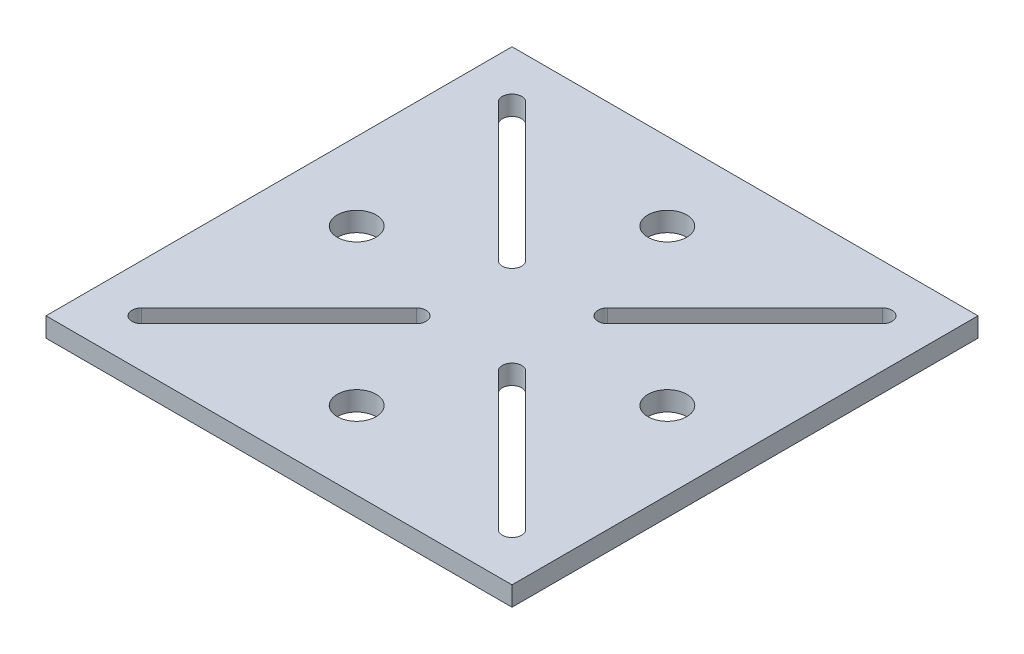
ISO-10303-21;
HEADER;
FILE_DESCRIPTION(('STEP AP214'),'2;1');
FILE_NAME('part.step','',(''),(''),'','','');
FILE_SCHEMA(('AUTOMOTIVE_DESIGN { 1 0 10303 214 1 1 1 1 }'));
ENDSEC;
DATA;
#1=APPLICATION_CONTEXT('core data for automotive mechanical design processes');
#2=APPLICATION_PROTOCOL_DEFINITION('international standard','automotive_design',2000,#1);
#3=PRODUCT_CONTEXT('',#1,'mechanical');
#4=PRODUCT('Part','Part','',(#3));
#5=PRODUCT_RELATED_PRODUCT_CATEGORY('part','',(#4));
#6=PRODUCT_DEFINITION_FORMATION('','',#4);
#7=PRODUCT_DEFINITION_CONTEXT('part definition',#1,'design');
#8=PRODUCT_DEFINITION('design','',#6,#7);
#9=PRODUCT_DEFINITION_SHAPE('','',#8);
#10=(LENGTH_UNIT() NAMED_UNIT(*) SI_UNIT(.MILLI.,.METRE.));
#11=(NAMED_UNIT(*) PLANE_ANGLE_UNIT() SI_UNIT($,.RADIAN.));
#12=(NAMED_UNIT(*) SI_UNIT($,.STERADIAN.) SOLID_ANGLE_UNIT());
#13=UNCERTAINTY_MEASURE_WITH_UNIT(LENGTH_MEASURE(1.E-05),#10,'distance_accuracy_value','');
#14=(GEOMETRIC_REPRESENTATION_CONTEXT(3) GLOBAL_UNCERTAINTY_ASSIGNED_CONTEXT((#13)) GLOBAL_UNIT_ASSIGNED_CONTEXT((#10,
#11,#12)) REPRESENTATION_CONTEXT('',''));
#15=CARTESIAN_POINT('',(0.,0.,0.));
#16=DIRECTION('',(0.,0.,1.));
#17=DIRECTION('',(1.,0.,0.));
#18=AXIS2_PLACEMENT_3D('',#15,#16,#17);
#19=CARTESIAN_POINT('',(0.,6.35,0.));
#20=DIRECTION('',(0.,-1.,0.));
#21=DIRECTION('',(0.,0.,-1.));
#22=AXIS2_PLACEMENT_3D('',#19,#20,#21);
#23=PLANE('',#22);
#24=CARTESIAN_POINT('',(136.750640302673,6.35,-15.6493596973271));
#25=DIRECTION('',(0.,1.,0.));
#26=DIRECTION('',(0.,0.,1.));
#27=AXIS2_PLACEMENT_3D('',#24,#25,#26);
#28=CIRCLE('',#27,3.17499999999973);
#29=CARTESIAN_POINT('',(134.505576272406,6.35,-13.4042956670599));
#30=VERTEX_POINT('',#29);
#31=CARTESIAN_POINT('',(138.99570433294,6.35,-17.8944237275941));
#32=VERTEX_POINT('',#31);
#33=EDGE_CURVE('E209',#30,#32,#28,.T.);
#34=ORIENTED_EDGE('',*,*,#33,.F.);
#35=DIRECTION('',(0.707106781186548,0.,0.707106781186547));
#36=VECTOR('',#35,1.);
#37=CARTESIAN_POINT('',(134.505576272406,6.35,-13.4042956670599));
#38=LINE('',#37,#36);
#39=CARTESIAN_POINT('',(89.6042956670599,6.35,-58.3055762724057));
#40=VERTEX_POINT('',#39);
#41=EDGE_CURVE('E217',#40,#30,#38,.T.);
#42=ORIENTED_EDGE('',*,*,#41,.F.);
#43=CARTESIAN_POINT('',(91.8493596973272,6.35,-60.5506403026729));
#44=DIRECTION('',(0.,1.,0.));
#45=DIRECTION('',(0.,0.,1.));
#46=AXIS2_PLACEMENT_3D('',#43,#44,#45);
#47=CIRCLE('',#46,3.17499999999975);
#48=CARTESIAN_POINT('',(94.0944237275943,6.35,-62.79570433294));
#49=VERTEX_POINT('',#48);
#50=EDGE_CURVE('E214',#49,#40,#47,.T.);
#51=ORIENTED_EDGE('',*,*,#50,.F.);
#52=DIRECTION('',(-0.707106781186547,0.,-0.707106781186548));
#53=VECTOR('',#52,1.);
#54=CARTESIAN_POINT('',(138.99570433294,6.35,-17.8944237275941));
#55=LINE('',#54,#53);
#56=EDGE_CURVE('E211',#32,#49,#55,.T.);
#57=ORIENTED_EDGE('',*,*,#56,.F.);
#58=EDGE_LOOP('',(#34,#42,#51,#57));
#59=FACE_BOUND('',#58,.T.);
#60=CARTESIAN_POINT('',(136.750640302673,6.35,-136.750640302673));
#61=DIRECTION('',(0.,1.,0.));
#62=DIRECTION('',(0.,0.,-1.));
#63=AXIS2_PLACEMENT_3D('',#60,#61,#62);
#64=CIRCLE('',#63,3.17499999999974);
#65=CARTESIAN_POINT('',(138.99570433294,6.35,-134.505576272406));
#66=VERTEX_POINT('',#65);
#67=CARTESIAN_POINT('',(134.505576272406,6.35,-138.99570433294));
#68=VERTEX_POINT('',#67);
#69=EDGE_CURVE('E271',#66,#68,#64,.T.);
#70=ORIENTED_EDGE('',*,*,#69,.F.);
#71=DIRECTION('',(0.707106781186548,0.,-0.707106781186548));
#72=VECTOR('',#71,1.);
#73=CARTESIAN_POINT('',(138.99570433294,6.35,-134.505576272406));
#74=LINE('',#73,#72);
#75=CARTESIAN_POINT('',(94.0944237275943,6.35,-89.6042956670602));
#76=VERTEX_POINT('',#75);
#77=EDGE_CURVE('E279',#76,#66,#74,.T.);
#78=ORIENTED_EDGE('',*,*,#77,.F.);
#79=CARTESIAN_POINT('',(91.8493596973272,6.35,-91.8493596973271));
#80=DIRECTION('',(0.,1.,0.));
#81=DIRECTION('',(0.,0.,-1.));
#82=AXIS2_PLACEMENT_3D('',#79,#80,#81);
#83=CIRCLE('',#82,3.17499999999975);
#84=CARTESIAN_POINT('',(89.6042956670599,6.35,-94.0944237275943));
#85=VERTEX_POINT('',#84);
#86=EDGE_CURVE('E276',#85,#76,#83,.T.);
#87=ORIENTED_EDGE('',*,*,#86,.F.);
#88=DIRECTION('',(-0.707106781186548,0.,0.707106781186547));
#89=VECTOR('',#88,1.);
#90=CARTESIAN_POINT('',(134.505576272406,6.35,-138.99570433294));
#91=LINE('',#90,#89);
#92=EDGE_CURVE('E273',#68,#85,#91,.T.);
#93=ORIENTED_EDGE('',*,*,#92,.F.);
#94=EDGE_LOOP('',(#70,#78,#87,#93));
#95=FACE_BOUND('',#94,.T.);
#96=DIRECTION('',(0.,0.,1.));
#97=VECTOR('',#96,1.);
#98=CARTESIAN_POINT('',(0.,6.35,0.));
#99=LINE('',#98,#97);
#100=CARTESIAN_POINT('',(0.,6.35,-152.4));
#101=VERTEX_POINT('',#100);
#102=CARTESIAN_POINT('',(0.,6.35,0.));
#103=VERTEX_POINT('',#102);
#104=EDGE_CURVE('E302',#101,#103,#99,.T.);
#105=ORIENTED_EDGE('',*,*,#104,.T.);
#106=DIRECTION('',(1.,0.,0.));
#107=VECTOR('',#106,1.);
#108=CARTESIAN_POINT('',(0.,6.35,0.));
#109=LINE('',#108,#107);
#110=CARTESIAN_POINT('',(152.4,6.35,0.));
#111=VERTEX_POINT('',#110);
#112=EDGE_CURVE('E305',#103,#111,#109,.T.);
#113=ORIENTED_EDGE('',*,*,#112,.T.);
#114=DIRECTION('',(0.,0.,-1.));
#115=VECTOR('',#114,1.);
#116=CARTESIAN_POINT('',(152.4,6.35,0.));
#117=LINE('',#116,#115);
#118=CARTESIAN_POINT('',(152.4,6.35,-152.4));
#119=VERTEX_POINT('',#118);
#120=EDGE_CURVE('E308',#111,#119,#117,.T.);
#121=ORIENTED_EDGE('',*,*,#120,.T.);
#122=DIRECTION('',(-1.,0.,0.));
#123=VECTOR('',#122,1.);
#124=CARTESIAN_POINT('',(0.,6.35,-152.4));
#125=LINE('',#124,#123);
#126=EDGE_CURVE('E310',#119,#101,#125,.T.);
#127=ORIENTED_EDGE('',*,*,#126,.T.);
#128=EDGE_LOOP('',(#105,#113,#121,#127));
#129=FACE_BOUND('',#128,.T.);
#130=CARTESIAN_POINT('',(15.649359697327,6.35,-136.750640302673));
#131=DIRECTION('',(0.,1.,0.));
#132=DIRECTION('',(0.,0.,1.));
#133=AXIS2_PLACEMENT_3D('',#130,#131,#132);
#134=CIRCLE('',#133,3.17499999999975);
#135=CARTESIAN_POINT('',(17.8944237275942,6.35,-138.99570433294));
#136=VERTEX_POINT('',#135);
#137=CARTESIAN_POINT('',(13.40429566706,6.35,-134.505576272406));
#138=VERTEX_POINT('',#137);
#139=EDGE_CURVE('E240',#136,#138,#134,.T.);
#140=ORIENTED_EDGE('',*,*,#139,.F.);
#141=DIRECTION('',(-0.707106781186548,0.,-0.707106781186547));
#142=VECTOR('',#141,1.);
#143=CARTESIAN_POINT('',(17.8944237275942,6.35,-138.99570433294));
#144=LINE('',#143,#142);
#145=CARTESIAN_POINT('',(62.79570433294,6.35,-94.0944237275943));
#146=VERTEX_POINT('',#145);
#147=EDGE_CURVE('E248',#146,#136,#144,.T.);
#148=ORIENTED_EDGE('',*,*,#147,.F.);
#149=CARTESIAN_POINT('',(60.5506403026728,6.35,-91.8493596973271));
#150=DIRECTION('',(0.,1.,0.));
#151=DIRECTION('',(0.,0.,1.));
#152=AXIS2_PLACEMENT_3D('',#149,#150,#151);
#153=CIRCLE('',#152,3.17499999999975);
#154=CARTESIAN_POINT('',(58.3055762724057,6.35,-89.6042956670599));
#155=VERTEX_POINT('',#154);
#156=EDGE_CURVE('E245',#155,#146,#153,.T.);
#157=ORIENTED_EDGE('',*,*,#156,.F.);
#158=DIRECTION('',(0.707106781186548,0.,0.707106781186547));
#159=VECTOR('',#158,1.);
#160=CARTESIAN_POINT('',(13.40429566706,6.35,-134.505576272406));
#161=LINE('',#160,#159);
#162=EDGE_CURVE('E242',#138,#155,#161,.T.);
#163=ORIENTED_EDGE('',*,*,#162,.F.);
#164=EDGE_LOOP('',(#140,#148,#157,#163));
#165=FACE_BOUND('',#164,.T.);
#166=CARTESIAN_POINT('',(15.649359697327,6.35,-15.6493596973271));
#167=DIRECTION('',(0.,1.,0.));
#168=DIRECTION('',(0.,0.,-1.));
#169=AXIS2_PLACEMENT_3D('',#166,#167,#168);
#170=CIRCLE('',#169,3.17499999999973);
#171=CARTESIAN_POINT('',(13.40429566706,6.35,-17.8944237275941));
#172=VERTEX_POINT('',#171);
#173=CARTESIAN_POINT('',(17.8944237275942,6.35,-13.4042956670599));
#174=VERTEX_POINT('',#173);
#175=EDGE_CURVE('E170',#172,#174,#170,.T.);
#176=ORIENTED_EDGE('',*,*,#175,.F.);
#177=DIRECTION('',(-0.707106781186547,0.,0.707106781186548));
#178=VECTOR('',#177,1.);
#179=CARTESIAN_POINT('',(13.40429566706,6.35,-17.8944237275941));
#180=LINE('',#179,#178);
#181=CARTESIAN_POINT('',(58.3055762724057,6.35,-62.7957043329398));
#182=VERTEX_POINT('',#181);
#183=EDGE_CURVE('E193',#182,#172,#180,.T.);
#184=ORIENTED_EDGE('',*,*,#183,.F.);
#185=CARTESIAN_POINT('',(60.5506403026728,6.35,-60.5506403026729));
#186=DIRECTION('',(0.,1.,0.));
#187=DIRECTION('',(0.,0.,-1.));
#188=AXIS2_PLACEMENT_3D('',#185,#186,#187);
#189=CIRCLE('',#188,3.17499999999975);
#190=CARTESIAN_POINT('',(62.79570433294,6.35,-58.3055762724057));
#191=VERTEX_POINT('',#190);
#192=EDGE_CURVE('E191',#191,#182,#189,.T.);
#193=ORIENTED_EDGE('',*,*,#192,.F.);
#194=DIRECTION('',(0.707106781186548,0.,-0.707106781186547));
#195=VECTOR('',#194,1.);
#196=CARTESIAN_POINT('',(17.8944237275942,6.35,-13.4042956670599));
#197=LINE('',#196,#195);
#198=EDGE_CURVE('E178',#174,#191,#197,.T.);
#199=ORIENTED_EDGE('',*,*,#198,.F.);
#200=EDGE_LOOP('',(#176,#184,#193,#199));
#201=FACE_BOUND('',#200,.T.);
#202=CARTESIAN_POINT('',(25.4,6.35,-76.2));
#203=DIRECTION('',(0.,1.,0.));
#204=DIRECTION('',(0.,0.,1.));
#205=AXIS2_PLACEMENT_3D('',#202,#203,#204);
#206=CIRCLE('',#205,6.34999999999999);
#207=CARTESIAN_POINT('',(25.4,6.35,-69.85));
#208=VERTEX_POINT('',#207);
#209=EDGE_CURVE('E199',#208,#208,#206,.T.);
#210=ORIENTED_EDGE('',*,*,#209,.F.);
#211=EDGE_LOOP('',(#210));
#212=FACE_BOUND('',#211,.T.);
#213=CARTESIAN_POINT('',(76.2,6.35,-127.));
#214=DIRECTION('',(0.,1.,0.));
#215=DIRECTION('',(0.,0.,1.));
#216=AXIS2_PLACEMENT_3D('',#213,#214,#215);
#217=CIRCLE('',#216,6.34999999999999);
#218=CARTESIAN_POINT('',(76.2,6.35,-120.65));
#219=VERTEX_POINT('',#218);
#220=EDGE_CURVE('E476',#219,#219,#217,.T.);
#221=ORIENTED_EDGE('',*,*,#220,.F.);
#222=EDGE_LOOP('',(#221));
#223=FACE_BOUND('',#222,.T.);
#224=CARTESIAN_POINT('',(127.,6.35,-76.2));
#225=DIRECTION('',(0.,1.,0.));
#226=DIRECTION('',(0.,0.,1.));
#227=AXIS2_PLACEMENT_3D('',#224,#225,#226);
#228=CIRCLE('',#227,6.34999999999999);
#229=CARTESIAN_POINT('',(127.,6.35,-69.85));
#230=VERTEX_POINT('',#229);
#231=EDGE_CURVE('E470',#230,#230,#228,.T.);
#232=ORIENTED_EDGE('',*,*,#231,.F.);
#233=EDGE_LOOP('',(#232));
#234=FACE_BOUND('',#233,.T.);
#235=CARTESIAN_POINT('',(76.2,6.35,-25.4));
#236=DIRECTION('',(0.,1.,0.));
#237=DIRECTION('',(0.,0.,1.));
#238=AXIS2_PLACEMENT_3D('',#235,#236,#237);
#239=CIRCLE('',#238,6.35);
#240=CARTESIAN_POINT('',(76.2,6.35,-19.05));
#241=VERTEX_POINT('',#240);
#242=EDGE_CURVE('E461',#241,#241,#239,.T.);
#243=ORIENTED_EDGE('',*,*,#242,.F.);
#244=EDGE_LOOP('',(#243));
#245=FACE_BOUND('',#244,.T.);
#246=ADVANCED_FACE('F33',(#59,#95,#129,#165,#201,#212,#223,#234,#245),#23,.F.);
#247=CARTESIAN_POINT('',(0.,0.,0.));
#248=DIRECTION('',(0.,-1.,0.));
#249=DIRECTION('',(0.,0.,-1.));
#250=AXIS2_PLACEMENT_3D('',#247,#248,#249);
#251=PLANE('',#250);
#252=CARTESIAN_POINT('',(127.,0.,-76.2));
#253=DIRECTION('',(0.,1.,0.));
#254=DIRECTION('',(0.,0.,1.));
#255=AXIS2_PLACEMENT_3D('',#252,#253,#254);
#256=CIRCLE('',#255,6.34999999999999);
#257=CARTESIAN_POINT('',(127.,0.,-69.85));
#258=VERTEX_POINT('',#257);
#259=EDGE_CURVE('E467',#258,#258,#256,.T.);
#260=ORIENTED_EDGE('',*,*,#259,.T.);
#261=EDGE_LOOP('',(#260));
#262=FACE_BOUND('',#261,.T.);
#263=CARTESIAN_POINT('',(25.4,0.,-76.2));
#264=DIRECTION('',(0.,1.,0.));
#265=DIRECTION('',(0.,0.,1.));
#266=AXIS2_PLACEMENT_3D('',#263,#264,#265);
#267=CIRCLE('',#266,6.34999999999999);
#268=CARTESIAN_POINT('',(25.4,0.,-69.85));
#269=VERTEX_POINT('',#268);
#270=EDGE_CURVE('E479',#269,#269,#267,.T.);
#271=ORIENTED_EDGE('',*,*,#270,.T.);
#272=EDGE_LOOP('',(#271));
#273=FACE_BOUND('',#272,.T.);
#274=DIRECTION('',(0.,0.,1.));
#275=VECTOR('',#274,1.);
#276=CARTESIAN_POINT('',(0.,0.,0.));
#277=LINE('',#276,#275);
#278=CARTESIAN_POINT('',(0.,0.,-152.4));
#279=VERTEX_POINT('',#278);
#280=CARTESIAN_POINT('',(0.,0.,0.));
#281=VERTEX_POINT('',#280);
#282=EDGE_CURVE('E301',#279,#281,#277,.T.);
#283=ORIENTED_EDGE('',*,*,#282,.F.);
#284=DIRECTION('',(-1.,0.,0.));
#285=VECTOR('',#284,1.);
#286=CARTESIAN_POINT('',(0.,0.,-152.4));
#287=LINE('',#286,#285);
#288=CARTESIAN_POINT('',(152.4,0.,-152.4));
#289=VERTEX_POINT('',#288);
#290=EDGE_CURVE('E306',#289,#279,#287,.T.);
#291=ORIENTED_EDGE('',*,*,#290,.F.);
#292=DIRECTION('',(0.,0.,-1.));
#293=VECTOR('',#292,1.);
#294=CARTESIAN_POINT('',(152.4,0.,0.));
#295=LINE('',#294,#293);
#296=CARTESIAN_POINT('',(152.4,0.,0.));
#297=VERTEX_POINT('',#296);
#298=EDGE_CURVE('E317',#297,#289,#295,.T.);
#299=ORIENTED_EDGE('',*,*,#298,.F.);
#300=DIRECTION('',(1.,0.,0.));
#301=VECTOR('',#300,1.);
#302=CARTESIAN_POINT('',(0.,0.,0.));
#303=LINE('',#302,#301);
#304=EDGE_CURVE('E315',#281,#297,#303,.T.);
#305=ORIENTED_EDGE('',*,*,#304,.F.);
#306=EDGE_LOOP('',(#283,#291,#299,#305));
#307=FACE_BOUND('',#306,.T.);
#308=DIRECTION('',(0.707106781186548,0.,-0.707106781186548));
#309=VECTOR('',#308,1.);
#310=CARTESIAN_POINT('',(138.99570433294,0.,-134.505576272406));
#311=LINE('',#310,#309);
#312=CARTESIAN_POINT('',(94.0944237275943,0.,-89.6042956670599));
#313=VERTEX_POINT('',#312);
#314=CARTESIAN_POINT('',(138.99570433294,0.,-134.505576272406));
#315=VERTEX_POINT('',#314);
#316=EDGE_CURVE('E274',#313,#315,#311,.T.);
#317=ORIENTED_EDGE('',*,*,#316,.T.);
#318=CARTESIAN_POINT('',(136.750640302673,0.,-136.750640302673));
#319=DIRECTION('',(0.,1.,0.));
#320=DIRECTION('',(0.,0.,-1.));
#321=AXIS2_PLACEMENT_3D('',#318,#319,#320);
#322=CIRCLE('',#321,3.17499999999974);
#323=CARTESIAN_POINT('',(134.505576272406,0.,-138.99570433294));
#324=VERTEX_POINT('',#323);
#325=EDGE_CURVE('E270',#315,#324,#322,.T.);
#326=ORIENTED_EDGE('',*,*,#325,.T.);
#327=DIRECTION('',(-0.707106781186548,0.,0.707106781186547));
#328=VECTOR('',#327,1.);
#329=CARTESIAN_POINT('',(134.505576272406,0.,-138.99570433294));
#330=LINE('',#329,#328);
#331=CARTESIAN_POINT('',(89.6042956670599,0.,-94.0944237275943));
#332=VERTEX_POINT('',#331);
#333=EDGE_CURVE('E284',#324,#332,#330,.T.);
#334=ORIENTED_EDGE('',*,*,#333,.T.);
#335=CARTESIAN_POINT('',(91.8493596973272,0.,-91.8493596973271));
#336=DIRECTION('',(0.,1.,0.));
#337=DIRECTION('',(0.,0.,-1.));
#338=AXIS2_PLACEMENT_3D('',#335,#336,#337);
#339=CIRCLE('',#338,3.17499999999975);
#340=EDGE_CURVE('E287',#332,#313,#339,.T.);
#341=ORIENTED_EDGE('',*,*,#340,.T.);
#342=EDGE_LOOP('',(#317,#326,#334,#341));
#343=FACE_BOUND('',#342,.T.);
#344=DIRECTION('',(-0.707106781186548,0.,-0.707106781186547));
#345=VECTOR('',#344,1.);
#346=CARTESIAN_POINT('',(17.8944237275942,0.,-138.99570433294));
#347=LINE('',#346,#345);
#348=CARTESIAN_POINT('',(62.79570433294,0.,-94.0944237275943));
#349=VERTEX_POINT('',#348);
#350=CARTESIAN_POINT('',(17.8944237275942,0.,-138.99570433294));
#351=VERTEX_POINT('',#350);
#352=EDGE_CURVE('E243',#349,#351,#347,.T.);
#353=ORIENTED_EDGE('',*,*,#352,.T.);
#354=CARTESIAN_POINT('',(15.649359697327,0.,-136.750640302673));
#355=DIRECTION('',(0.,1.,0.));
#356=DIRECTION('',(0.,0.,1.));
#357=AXIS2_PLACEMENT_3D('',#354,#355,#356);
#358=CIRCLE('',#357,3.17499999999975);
#359=CARTESIAN_POINT('',(13.40429566706,0.,-134.505576272406));
#360=VERTEX_POINT('',#359);
#361=EDGE_CURVE('E239',#351,#360,#358,.T.);
#362=ORIENTED_EDGE('',*,*,#361,.T.);
#363=DIRECTION('',(0.707106781186548,0.,0.707106781186547));
#364=VECTOR('',#363,1.);
#365=CARTESIAN_POINT('',(13.40429566706,0.,-134.505576272406));
#366=LINE('',#365,#364);
#367=CARTESIAN_POINT('',(58.3055762724057,0.,-89.6042956670599));
#368=VERTEX_POINT('',#367);
#369=EDGE_CURVE('E253',#360,#368,#366,.T.);
#370=ORIENTED_EDGE('',*,*,#369,.T.);
#371=CARTESIAN_POINT('',(60.5506403026728,0.,-91.8493596973271));
#372=DIRECTION('',(0.,1.,0.));
#373=DIRECTION('',(0.,0.,1.));
#374=AXIS2_PLACEMENT_3D('',#371,#372,#373);
#375=CIRCLE('',#374,3.17499999999975);
#376=EDGE_CURVE('E256',#368,#349,#375,.T.);
#377=ORIENTED_EDGE('',*,*,#376,.T.);
#378=EDGE_LOOP('',(#353,#362,#370,#377));
#379=FACE_BOUND('',#378,.T.);
#380=DIRECTION('',(0.707106781186548,0.,0.707106781186547));
#381=VECTOR('',#380,1.);
#382=CARTESIAN_POINT('',(134.505576272406,0.,-13.4042956670599));
#383=LINE('',#382,#381);
#384=CARTESIAN_POINT('',(89.6042956670599,0.,-58.3055762724057));
#385=VERTEX_POINT('',#384);
#386=CARTESIAN_POINT('',(134.505576272406,0.,-13.4042956670599));
#387=VERTEX_POINT('',#386);
#388=EDGE_CURVE('E212',#385,#387,#383,.T.);
#389=ORIENTED_EDGE('',*,*,#388,.T.);
#390=CARTESIAN_POINT('',(136.750640302673,0.,-15.6493596973271));
#391=DIRECTION('',(0.,1.,0.));
#392=DIRECTION('',(0.,0.,1.));
#393=AXIS2_PLACEMENT_3D('',#390,#391,#392);
#394=CIRCLE('',#393,3.17499999999973);
#395=CARTESIAN_POINT('',(138.99570433294,0.,-17.8944237275941));
#396=VERTEX_POINT('',#395);
#397=EDGE_CURVE('E186',#387,#396,#394,.T.);
#398=ORIENTED_EDGE('',*,*,#397,.T.);
#399=DIRECTION('',(-0.707106781186547,0.,-0.707106781186548));
#400=VECTOR('',#399,1.);
#401=CARTESIAN_POINT('',(138.99570433294,0.,-17.8944237275941));
#402=LINE('',#401,#400);
#403=CARTESIAN_POINT('',(94.0944237275943,0.,-62.79570433294));
#404=VERTEX_POINT('',#403);
#405=EDGE_CURVE('E222',#396,#404,#402,.T.);
#406=ORIENTED_EDGE('',*,*,#405,.T.);
#407=CARTESIAN_POINT('',(91.8493596973272,0.,-60.5506403026729));
#408=DIRECTION('',(0.,1.,0.));
#409=DIRECTION('',(0.,0.,1.));
#410=AXIS2_PLACEMENT_3D('',#407,#408,#409);
#411=CIRCLE('',#410,3.17499999999975);
#412=EDGE_CURVE('E225',#404,#385,#411,.T.);
#413=ORIENTED_EDGE('',*,*,#412,.T.);
#414=EDGE_LOOP('',(#389,#398,#406,#413));
#415=FACE_BOUND('',#414,.T.);
#416=DIRECTION('',(-0.707106781186547,0.,0.707106781186548));
#417=VECTOR('',#416,1.);
#418=CARTESIAN_POINT('',(13.40429566706,0.,-17.8944237275941));
#419=LINE('',#418,#417);
#420=CARTESIAN_POINT('',(58.3055762724057,0.,-62.79570433294));
#421=VERTEX_POINT('',#420);
#422=CARTESIAN_POINT('',(13.40429566706,0.,-17.8944237275941));
#423=VERTEX_POINT('',#422);
#424=EDGE_CURVE('E179',#421,#423,#419,.T.);
#425=ORIENTED_EDGE('',*,*,#424,.T.);
#426=CARTESIAN_POINT('',(15.649359697327,0.,-15.6493596973271));
#427=DIRECTION('',(0.,1.,0.));
#428=DIRECTION('',(0.,0.,-1.));
#429=AXIS2_PLACEMENT_3D('',#426,#427,#428);
#430=CIRCLE('',#429,3.17499999999973);
#431=CARTESIAN_POINT('',(17.8944237275942,0.,-13.4042956670599));
#432=VERTEX_POINT('',#431);
#433=EDGE_CURVE('E56',#423,#432,#430,.T.);
#434=ORIENTED_EDGE('',*,*,#433,.T.);
#435=DIRECTION('',(0.707106781186548,0.,-0.707106781186547));
#436=VECTOR('',#435,1.);
#437=CARTESIAN_POINT('',(17.8944237275942,0.,-13.4042956670599));
#438=LINE('',#437,#436);
#439=CARTESIAN_POINT('',(62.79570433294,0.,-58.3055762724057));
#440=VERTEX_POINT('',#439);
#441=EDGE_CURVE('E185',#432,#440,#438,.T.);
#442=ORIENTED_EDGE('',*,*,#441,.T.);
#443=CARTESIAN_POINT('',(60.5506403026728,0.,-60.5506403026729));
#444=DIRECTION('',(0.,1.,0.));
#445=DIRECTION('',(0.,0.,-1.));
#446=AXIS2_PLACEMENT_3D('',#443,#444,#445);
#447=CIRCLE('',#446,3.17499999999975);
#448=EDGE_CURVE('E201',#440,#421,#447,.T.);
#449=ORIENTED_EDGE('',*,*,#448,.T.);
#450=EDGE_LOOP('',(#425,#434,#442,#449));
#451=FACE_BOUND('',#450,.T.);
#452=CARTESIAN_POINT('',(76.2,0.,-127.));
#453=DIRECTION('',(0.,1.,0.));
#454=DIRECTION('',(0.,0.,1.));
#455=AXIS2_PLACEMENT_3D('',#452,#453,#454);
#456=CIRCLE('',#455,6.34999999999999);
#457=CARTESIAN_POINT('',(76.2,0.,-120.65));
#458=VERTEX_POINT('',#457);
#459=EDGE_CURVE('E473',#458,#458,#456,.T.);
#460=ORIENTED_EDGE('',*,*,#459,.T.);
#461=EDGE_LOOP('',(#460));
#462=FACE_BOUND('',#461,.T.);
#463=CARTESIAN_POINT('',(76.2,0.,-25.4));
#464=DIRECTION('',(0.,1.,0.));
#465=DIRECTION('',(0.,0.,1.));
#466=AXIS2_PLACEMENT_3D('',#463,#464,#465);
#467=CIRCLE('',#466,6.35);
#468=CARTESIAN_POINT('',(76.2,0.,-19.05));
#469=VERTEX_POINT('',#468);
#470=EDGE_CURVE('E464',#469,#469,#467,.T.);
#471=ORIENTED_EDGE('',*,*,#470,.T.);
#472=EDGE_LOOP('',(#471));
#473=FACE_BOUND('',#472,.T.);
#474=ADVANCED_FACE('F335',(#262,#273,#307,#343,#379,#415,#451,#462,#473),#251,.T.);
#475=CARTESIAN_POINT('',(0.,6.35,0.));
#476=DIRECTION('',(1.,0.,0.));
#477=DIRECTION('',(0.,0.,-1.));
#478=AXIS2_PLACEMENT_3D('',#475,#476,#477);
#479=PLANE('',#478);
#480=ORIENTED_EDGE('',*,*,#282,.T.);
#481=DIRECTION('',(0.,-1.,0.));
#482=VECTOR('',#481,1.);
#483=CARTESIAN_POINT('',(0.,6.35,0.));
#484=LINE('',#483,#482);
#485=EDGE_CURVE('E11',#103,#281,#484,.T.);
#486=ORIENTED_EDGE('',*,*,#485,.F.);
#487=ORIENTED_EDGE('',*,*,#104,.F.);
#488=DIRECTION('',(0.,-1.,0.));
#489=VECTOR('',#488,1.);
#490=CARTESIAN_POINT('',(0.,6.35,-152.4));
#491=LINE('',#490,#489);
#492=EDGE_CURVE('E312',#101,#279,#491,.T.);
#493=ORIENTED_EDGE('',*,*,#492,.T.);
#494=EDGE_LOOP('',(#480,#486,#487,#493));
#495=FACE_BOUND('',#494,.T.);
#496=ADVANCED_FACE('F35',(#495),#479,.F.);
#497=CARTESIAN_POINT('',(0.,6.35,0.));
#498=DIRECTION('',(0.,0.,-1.));
#499=DIRECTION('',(-1.,0.,0.));
#500=AXIS2_PLACEMENT_3D('',#497,#498,#499);
#501=PLANE('',#500);
#502=ORIENTED_EDGE('',*,*,#304,.T.);
#503=DIRECTION('',(0.,-1.,0.));
#504=VECTOR('',#503,1.);
#505=CARTESIAN_POINT('',(152.4,6.35,0.));
#506=LINE('',#505,#504);
#507=EDGE_CURVE('E41',#111,#297,#506,.T.);
#508=ORIENTED_EDGE('',*,*,#507,.F.);
#509=ORIENTED_EDGE('',*,*,#112,.F.);
#510=ORIENTED_EDGE('',*,*,#485,.T.);
#511=EDGE_LOOP('',(#502,#508,#509,#510));
#512=FACE_BOUND('',#511,.T.);
#513=ADVANCED_FACE('F346',(#512),#501,.F.);
#514=CARTESIAN_POINT('',(152.4,6.35,0.));
#515=DIRECTION('',(-1.,0.,0.));
#516=DIRECTION('',(0.,0.,1.));
#517=AXIS2_PLACEMENT_3D('',#514,#515,#516);
#518=PLANE('',#517);
#519=ORIENTED_EDGE('',*,*,#298,.T.);
#520=DIRECTION('',(0.,-1.,0.));
#521=VECTOR('',#520,1.);
#522=CARTESIAN_POINT('',(152.4,6.35,-152.4));
#523=LINE('',#522,#521);
#524=EDGE_CURVE('E322',#119,#289,#523,.T.);
#525=ORIENTED_EDGE('',*,*,#524,.F.);
#526=ORIENTED_EDGE('',*,*,#120,.F.);
#527=ORIENTED_EDGE('',*,*,#507,.T.);
#528=EDGE_LOOP('',(#519,#525,#526,#527));
#529=FACE_BOUND('',#528,.T.);
#530=ADVANCED_FACE('F329',(#529),#518,.F.);
#531=CARTESIAN_POINT('',(0.,6.35,-152.4));
#532=DIRECTION('',(0.,0.,1.));
#533=DIRECTION('',(1.,0.,0.));
#534=AXIS2_PLACEMENT_3D('',#531,#532,#533);
#535=PLANE('',#534);
#536=ORIENTED_EDGE('',*,*,#290,.T.);
#537=ORIENTED_EDGE('',*,*,#492,.F.);
#538=ORIENTED_EDGE('',*,*,#126,.F.);
#539=ORIENTED_EDGE('',*,*,#524,.T.);
#540=EDGE_LOOP('',(#536,#537,#538,#539));
#541=FACE_BOUND('',#540,.T.);
#542=ADVANCED_FACE('F339',(#541),#535,.F.);
#543=CARTESIAN_POINT('',(136.750640302673,6.35,-136.750640302673));
#544=DIRECTION('',(0.,-1.,0.));
#545=DIRECTION('',(0.,0.,-1.));
#546=AXIS2_PLACEMENT_3D('',#543,#544,#545);
#547=CYLINDRICAL_SURFACE('',#546,3.17499999999974);
#548=ORIENTED_EDGE('',*,*,#325,.F.);
#549=DIRECTION('',(0.,-1.,0.));
#550=VECTOR('',#549,1.);
#551=CARTESIAN_POINT('',(138.99570433294,6.35,-134.505576272406));
#552=LINE('',#551,#550);
#553=EDGE_CURVE('E281',#66,#315,#552,.T.);
#554=ORIENTED_EDGE('',*,*,#553,.F.);
#555=ORIENTED_EDGE('',*,*,#69,.T.);
#556=DIRECTION('',(0.,-1.,0.));
#557=VECTOR('',#556,1.);
#558=CARTESIAN_POINT('',(134.505576272406,6.35,-138.99570433294));
#559=LINE('',#558,#557);
#560=EDGE_CURVE('E298',#68,#324,#559,.T.);
#561=ORIENTED_EDGE('',*,*,#560,.T.);
#562=EDGE_LOOP('',(#548,#554,#555,#561));
#563=FACE_BOUND('',#562,.T.);
#564=ADVANCED_FACE('F364',(#563),#547,.F.);
#565=CARTESIAN_POINT('',(134.505576272406,6.35,-138.99570433294));
#566=DIRECTION('',(0.707106781186547,0.,0.707106781186548));
#567=DIRECTION('',(0.707106781186548,0.,-0.707106781186547));
#568=AXIS2_PLACEMENT_3D('',#565,#566,#567);
#569=PLANE('',#568);
#570=ORIENTED_EDGE('',*,*,#333,.F.);
#571=ORIENTED_EDGE('',*,*,#560,.F.);
#572=ORIENTED_EDGE('',*,*,#92,.T.);
#573=DIRECTION('',(0.,-1.,0.));
#574=VECTOR('',#573,1.);
#575=CARTESIAN_POINT('',(89.6042956670599,6.35,-94.0944237275943));
#576=LINE('',#575,#574);
#577=EDGE_CURVE('E296',#85,#332,#576,.T.);
#578=ORIENTED_EDGE('',*,*,#577,.T.);
#579=EDGE_LOOP('',(#570,#571,#572,#578));
#580=FACE_BOUND('',#579,.T.);
#581=ADVANCED_FACE('F371',(#580),#569,.T.);
#582=CARTESIAN_POINT('',(91.8493596973272,6.35,-91.8493596973271));
#583=DIRECTION('',(0.,-1.,0.));
#584=DIRECTION('',(0.,0.,-1.));
#585=AXIS2_PLACEMENT_3D('',#582,#583,#584);
#586=CYLINDRICAL_SURFACE('',#585,3.17499999999975);
#587=ORIENTED_EDGE('',*,*,#340,.F.);
#588=ORIENTED_EDGE('',*,*,#577,.F.);
#589=ORIENTED_EDGE('',*,*,#86,.T.);
#590=DIRECTION('',(0.,-1.,0.));
#591=VECTOR('',#590,1.);
#592=CARTESIAN_POINT('',(94.0944237275943,6.35,-89.6042956670599));
#593=LINE('',#592,#591);
#594=EDGE_CURVE('E294',#76,#313,#593,.T.);
#595=ORIENTED_EDGE('',*,*,#594,.T.);
#596=EDGE_LOOP('',(#587,#588,#589,#595));
#597=FACE_BOUND('',#596,.T.);
#598=ADVANCED_FACE('F376',(#597),#586,.F.);
#599=CARTESIAN_POINT('',(138.99570433294,6.35,-134.505576272406));
#600=DIRECTION('',(-0.707106781186548,0.,-0.707106781186548));
#601=DIRECTION('',(-0.707106781186548,0.,0.707106781186548));
#602=AXIS2_PLACEMENT_3D('',#599,#600,#601);
#603=PLANE('',#602);
#604=ORIENTED_EDGE('',*,*,#316,.F.);
#605=ORIENTED_EDGE('',*,*,#594,.F.);
#606=ORIENTED_EDGE('',*,*,#77,.T.);
#607=ORIENTED_EDGE('',*,*,#553,.T.);
#608=EDGE_LOOP('',(#604,#605,#606,#607));
#609=FACE_BOUND('',#608,.T.);
#610=ADVANCED_FACE('F383',(#609),#603,.T.);
#611=CARTESIAN_POINT('',(15.649359697327,6.35,-136.750640302673));
#612=DIRECTION('',(0.,-1.,0.));
#613=DIRECTION('',(0.,0.,-1.));
#614=AXIS2_PLACEMENT_3D('',#611,#612,#613);
#615=CYLINDRICAL_SURFACE('',#614,3.17499999999975);
#616=ORIENTED_EDGE('',*,*,#361,.F.);
#617=DIRECTION('',(0.,-1.,0.));
#618=VECTOR('',#617,1.);
#619=CARTESIAN_POINT('',(17.8944237275942,6.35,-138.99570433294));
#620=LINE('',#619,#618);
#621=EDGE_CURVE('E250',#136,#351,#620,.T.);
#622=ORIENTED_EDGE('',*,*,#621,.F.);
#623=ORIENTED_EDGE('',*,*,#139,.T.);
#624=DIRECTION('',(0.,-1.,0.));
#625=VECTOR('',#624,1.);
#626=CARTESIAN_POINT('',(13.40429566706,6.35,-134.505576272406));
#627=LINE('',#626,#625);
#628=EDGE_CURVE('E267',#138,#360,#627,.T.);
#629=ORIENTED_EDGE('',*,*,#628,.T.);
#630=EDGE_LOOP('',(#616,#622,#623,#629));
#631=FACE_BOUND('',#630,.T.);
#632=ADVANCED_FACE('F396',(#631),#615,.F.);
#633=CARTESIAN_POINT('',(13.40429566706,6.35,-134.505576272406));
#634=DIRECTION('',(0.707106781186547,0.,-0.707106781186548));
#635=DIRECTION('',(-0.707106781186548,0.,-0.707106781186547));
#636=AXIS2_PLACEMENT_3D('',#633,#634,#635);
#637=PLANE('',#636);
#638=ORIENTED_EDGE('',*,*,#369,.F.);
#639=ORIENTED_EDGE('',*,*,#628,.F.);
#640=ORIENTED_EDGE('',*,*,#162,.T.);
#641=DIRECTION('',(0.,-1.,0.));
#642=VECTOR('',#641,1.);
#643=CARTESIAN_POINT('',(58.3055762724057,6.35,-89.6042956670599));
#644=LINE('',#643,#642);
#645=EDGE_CURVE('E265',#155,#368,#644,.T.);
#646=ORIENTED_EDGE('',*,*,#645,.T.);
#647=EDGE_LOOP('',(#638,#639,#640,#646));
#648=FACE_BOUND('',#647,.T.);
#649=ADVANCED_FACE('F401',(#648),#637,.T.);
#650=CARTESIAN_POINT('',(60.5506403026728,6.35,-91.8493596973271));
#651=DIRECTION('',(0.,-1.,0.));
#652=DIRECTION('',(0.,0.,-1.));
#653=AXIS2_PLACEMENT_3D('',#650,#651,#652);
#654=CYLINDRICAL_SURFACE('',#653,3.17499999999975);
#655=ORIENTED_EDGE('',*,*,#376,.F.);
#656=ORIENTED_EDGE('',*,*,#645,.F.);
#657=ORIENTED_EDGE('',*,*,#156,.T.);
#658=DIRECTION('',(0.,-1.,0.));
#659=VECTOR('',#658,1.);
#660=CARTESIAN_POINT('',(62.79570433294,6.35,-94.0944237275943));
#661=LINE('',#660,#659);
#662=EDGE_CURVE('E263',#146,#349,#661,.T.);
#663=ORIENTED_EDGE('',*,*,#662,.T.);
#664=EDGE_LOOP('',(#655,#656,#657,#663));
#665=FACE_BOUND('',#664,.T.);
#666=ADVANCED_FACE('F405',(#665),#654,.F.);
#667=CARTESIAN_POINT('',(17.8944237275942,6.35,-138.99570433294));
#668=DIRECTION('',(-0.707106781186547,0.,0.707106781186548));
#669=DIRECTION('',(0.707106781186548,0.,0.707106781186547));
#670=AXIS2_PLACEMENT_3D('',#667,#668,#669);
#671=PLANE('',#670);
#672=ORIENTED_EDGE('',*,*,#352,.F.);
#673=ORIENTED_EDGE('',*,*,#662,.F.);
#674=ORIENTED_EDGE('',*,*,#147,.T.);
#675=ORIENTED_EDGE('',*,*,#621,.T.);
#676=EDGE_LOOP('',(#672,#673,#674,#675));
#677=FACE_BOUND('',#676,.T.);
#678=ADVANCED_FACE('F409',(#677),#671,.T.);
#679=CARTESIAN_POINT('',(136.750640302673,6.35,-15.6493596973271));
#680=DIRECTION('',(0.,-1.,0.));
#681=DIRECTION('',(0.,0.,-1.));
#682=AXIS2_PLACEMENT_3D('',#679,#680,#681);
#683=CYLINDRICAL_SURFACE('',#682,3.17499999999973);
#684=ORIENTED_EDGE('',*,*,#397,.F.);
#685=DIRECTION('',(0.,-1.,0.));
#686=VECTOR('',#685,1.);
#687=CARTESIAN_POINT('',(134.505576272406,6.35,-13.4042956670599));
#688=LINE('',#687,#686);
#689=EDGE_CURVE('E219',#30,#387,#688,.T.);
#690=ORIENTED_EDGE('',*,*,#689,.F.);
#691=ORIENTED_EDGE('',*,*,#33,.T.);
#692=DIRECTION('',(0.,-1.,0.));
#693=VECTOR('',#692,1.);
#694=CARTESIAN_POINT('',(138.99570433294,6.35,-17.8944237275941));
#695=LINE('',#694,#693);
#696=EDGE_CURVE('E236',#32,#396,#695,.T.);
#697=ORIENTED_EDGE('',*,*,#696,.T.);
#698=EDGE_LOOP('',(#684,#690,#691,#697));
#699=FACE_BOUND('',#698,.T.);
#700=ADVANCED_FACE('F413',(#699),#683,.F.);
#701=CARTESIAN_POINT('',(138.99570433294,6.35,-17.8944237275941));
#702=DIRECTION('',(-0.707106781186548,0.,0.707106781186547));
#703=DIRECTION('',(0.707106781186547,0.,0.707106781186548));
#704=AXIS2_PLACEMENT_3D('',#701,#702,#703);
#705=PLANE('',#704);
#706=ORIENTED_EDGE('',*,*,#405,.F.);
#707=ORIENTED_EDGE('',*,*,#696,.F.);
#708=ORIENTED_EDGE('',*,*,#56,.T.);
#709=DIRECTION('',(0.,-1.,0.));
#710=VECTOR('',#709,1.);
#711=CARTESIAN_POINT('',(94.0944237275943,6.35,-62.79570433294));
#712=LINE('',#711,#710);
#713=EDGE_CURVE('E234',#49,#404,#712,.T.);
#714=ORIENTED_EDGE('',*,*,#713,.T.);
#715=EDGE_LOOP('',(#706,#707,#708,#714));
#716=FACE_BOUND('',#715,.T.);
#717=ADVANCED_FACE('F417',(#716),#705,.T.);
#718=CARTESIAN_POINT('',(91.8493596973272,6.35,-60.5506403026729));
#719=DIRECTION('',(0.,-1.,0.));
#720=DIRECTION('',(0.,0.,-1.));
#721=AXIS2_PLACEMENT_3D('',#718,#719,#720);
#722=CYLINDRICAL_SURFACE('',#721,3.17499999999975);
#723=ORIENTED_EDGE('',*,*,#412,.F.);
#724=ORIENTED_EDGE('',*,*,#713,.F.);
#725=ORIENTED_EDGE('',*,*,#50,.T.);
#726=DIRECTION('',(0.,-1.,0.));
#727=VECTOR('',#726,1.);
#728=CARTESIAN_POINT('',(89.6042956670599,6.35,-58.3055762724057));
#729=LINE('',#728,#727);
#730=EDGE_CURVE('E232',#40,#385,#729,.T.);
#731=ORIENTED_EDGE('',*,*,#730,.T.);
#732=EDGE_LOOP('',(#723,#724,#725,#731));
#733=FACE_BOUND('',#732,.T.);
#734=ADVANCED_FACE('F421',(#733),#722,.F.);
#735=CARTESIAN_POINT('',(134.505576272406,6.35,-13.4042956670599));
#736=DIRECTION('',(0.707106781186547,0.,-0.707106781186548));
#737=DIRECTION('',(-0.707106781186548,0.,-0.707106781186547));
#738=AXIS2_PLACEMENT_3D('',#735,#736,#737);
#739=PLANE('',#738);
#740=ORIENTED_EDGE('',*,*,#388,.F.);
#741=ORIENTED_EDGE('',*,*,#730,.F.);
#742=ORIENTED_EDGE('',*,*,#41,.T.);
#743=ORIENTED_EDGE('',*,*,#689,.T.);
#744=EDGE_LOOP('',(#740,#741,#742,#743));
#745=FACE_BOUND('',#744,.T.);
#746=ADVANCED_FACE('F425',(#745),#739,.T.);
#747=CARTESIAN_POINT('',(15.649359697327,6.35,-15.6493596973271));
#748=DIRECTION('',(0.,-1.,0.));
#749=DIRECTION('',(0.,0.,-1.));
#750=AXIS2_PLACEMENT_3D('',#747,#748,#749);
#751=CYLINDRICAL_SURFACE('',#750,3.17499999999973);
#752=ORIENTED_EDGE('',*,*,#433,.F.);
#753=DIRECTION('',(0.,-1.,0.));
#754=VECTOR('',#753,1.);
#755=CARTESIAN_POINT('',(13.40429566706,6.35,-17.8944237275941));
#756=LINE('',#755,#754);
#757=EDGE_CURVE('E174',#172,#423,#756,.T.);
#758=ORIENTED_EDGE('',*,*,#757,.F.);
#759=ORIENTED_EDGE('',*,*,#175,.T.);
#760=DIRECTION('',(0.,-1.,0.));
#761=VECTOR('',#760,1.);
#762=CARTESIAN_POINT('',(17.8944237275942,6.35,-13.4042956670599));
#763=LINE('',#762,#761);
#764=EDGE_CURVE('E173',#174,#432,#763,.T.);
#765=ORIENTED_EDGE('',*,*,#764,.T.);
#766=EDGE_LOOP('',(#752,#758,#759,#765));
#767=FACE_BOUND('',#766,.T.);
#768=ADVANCED_FACE('F172',(#767),#751,.F.);
#769=CARTESIAN_POINT('',(17.8944237275942,6.35,-13.4042956670599));
#770=DIRECTION('',(-0.707106781186547,0.,-0.707106781186548));
#771=DIRECTION('',(-0.707106781186548,0.,0.707106781186547));
#772=AXIS2_PLACEMENT_3D('',#769,#770,#771);
#773=PLANE('',#772);
#774=ORIENTED_EDGE('',*,*,#441,.F.);
#775=ORIENTED_EDGE('',*,*,#764,.F.);
#776=ORIENTED_EDGE('',*,*,#198,.T.);
#777=DIRECTION('',(0.,-1.,0.));
#778=VECTOR('',#777,1.);
#779=CARTESIAN_POINT('',(62.79570433294,6.35,-58.3055762724057));
#780=LINE('',#779,#778);
#781=EDGE_CURVE('E187',#191,#440,#780,.T.);
#782=ORIENTED_EDGE('',*,*,#781,.T.);
#783=EDGE_LOOP('',(#774,#775,#776,#782));
#784=FACE_BOUND('',#783,.T.);
#785=ADVANCED_FACE('F182',(#784),#773,.T.);
#786=CARTESIAN_POINT('',(60.5506403026728,6.35,-60.5506403026729));
#787=DIRECTION('',(0.,-1.,0.));
#788=DIRECTION('',(0.,0.,-1.));
#789=AXIS2_PLACEMENT_3D('',#786,#787,#788);
#790=CYLINDRICAL_SURFACE('',#789,3.17499999999975);
#791=ORIENTED_EDGE('',*,*,#448,.F.);
#792=ORIENTED_EDGE('',*,*,#781,.F.);
#793=ORIENTED_EDGE('',*,*,#192,.T.);
#794=DIRECTION('',(0.,-1.,0.));
#795=VECTOR('',#794,1.);
#796=CARTESIAN_POINT('',(58.3055762724057,6.35,-62.79570433294));
#797=LINE('',#796,#795);
#798=EDGE_CURVE('E48',#182,#421,#797,.T.);
#799=ORIENTED_EDGE('',*,*,#798,.T.);
#800=EDGE_LOOP('',(#791,#792,#793,#799));
#801=FACE_BOUND('',#800,.T.);
#802=ADVANCED_FACE('F434',(#801),#790,.F.);
#803=CARTESIAN_POINT('',(13.40429566706,6.35,-17.8944237275941));
#804=DIRECTION('',(0.707106781186548,0.,0.707106781186547));
#805=DIRECTION('',(0.707106781186547,0.,-0.707106781186548));
#806=AXIS2_PLACEMENT_3D('',#803,#804,#805);
#807=PLANE('',#806);
#808=ORIENTED_EDGE('',*,*,#424,.F.);
#809=ORIENTED_EDGE('',*,*,#798,.F.);
#810=ORIENTED_EDGE('',*,*,#183,.T.);
#811=ORIENTED_EDGE('',*,*,#757,.T.);
#812=EDGE_LOOP('',(#808,#809,#810,#811));
#813=FACE_BOUND('',#812,.T.);
#814=ADVANCED_FACE('F437',(#813),#807,.T.);
#815=CARTESIAN_POINT('',(25.4,6.35,-76.2));
#816=DIRECTION('',(0.,-1.,0.));
#817=DIRECTION('',(0.,0.,-1.));
#818=AXIS2_PLACEMENT_3D('',#815,#816,#817);
#819=CYLINDRICAL_SURFACE('',#818,6.34999999999999);
#820=ORIENTED_EDGE('',*,*,#209,.T.);
#821=EDGE_LOOP('',(#820));
#822=FACE_BOUND('',#821,.T.);
#823=ORIENTED_EDGE('',*,*,#270,.F.);
#824=EDGE_LOOP('',(#823));
#825=FACE_BOUND('',#824,.T.);
#826=ADVANCED_FACE('F441',(#822,#825),#819,.F.);
#827=CARTESIAN_POINT('',(76.2,6.35,-127.));
#828=DIRECTION('',(0.,-1.,0.));
#829=DIRECTION('',(0.,0.,-1.));
#830=AXIS2_PLACEMENT_3D('',#827,#828,#829);
#831=CYLINDRICAL_SURFACE('',#830,6.34999999999999);
#832=ORIENTED_EDGE('',*,*,#220,.T.);
#833=EDGE_LOOP('',(#832));
#834=FACE_BOUND('',#833,.T.);
#835=ORIENTED_EDGE('',*,*,#459,.F.);
#836=EDGE_LOOP('',(#835));
#837=FACE_BOUND('',#836,.T.);
#838=ADVANCED_FACE('F444',(#834,#837),#831,.F.);
#839=CARTESIAN_POINT('',(127.,6.35,-76.2));
#840=DIRECTION('',(0.,-1.,0.));
#841=DIRECTION('',(0.,0.,-1.));
#842=AXIS2_PLACEMENT_3D('',#839,#840,#841);
#843=CYLINDRICAL_SURFACE('',#842,6.34999999999999);
#844=ORIENTED_EDGE('',*,*,#231,.T.);
#845=EDGE_LOOP('',(#844));
#846=FACE_BOUND('',#845,.T.);
#847=ORIENTED_EDGE('',*,*,#259,.F.);
#848=EDGE_LOOP('',(#847));
#849=FACE_BOUND('',#848,.T.);
#850=ADVANCED_FACE('F448',(#846,#849),#843,.F.);
#851=CARTESIAN_POINT('',(76.2,6.35,-25.4));
#852=DIRECTION('',(0.,-1.,0.));
#853=DIRECTION('',(0.,0.,-1.));
#854=AXIS2_PLACEMENT_3D('',#851,#852,#853);
#855=CYLINDRICAL_SURFACE('',#854,6.35);
#856=ORIENTED_EDGE('',*,*,#242,.T.);
#857=EDGE_LOOP('',(#856));
#858=FACE_BOUND('',#857,.T.);
#859=ORIENTED_EDGE('',*,*,#470,.F.);
#860=EDGE_LOOP('',(#859));
#861=FACE_BOUND('',#860,.T.);
#862=ADVANCED_FACE('F452',(#858,#861),#855,.F.);
#863=CLOSED_SHELL('',(#246,#474,#496,#513,#530,#542,#564,#581,#598,#610,#632,#649,#666,#678,
#700,#717,#734,#746,#768,#785,#802,#814,#826,#838,#850,#862));
#864=MANIFOLD_SOLID_BREP('B2',#863);
#865=ADVANCED_BREP_SHAPE_REPRESENTATION('',(#18,#864),#14);
#866=SHAPE_DEFINITION_REPRESENTATION(#9,#865);
ENDSEC;
END-ISO-10303-21;
